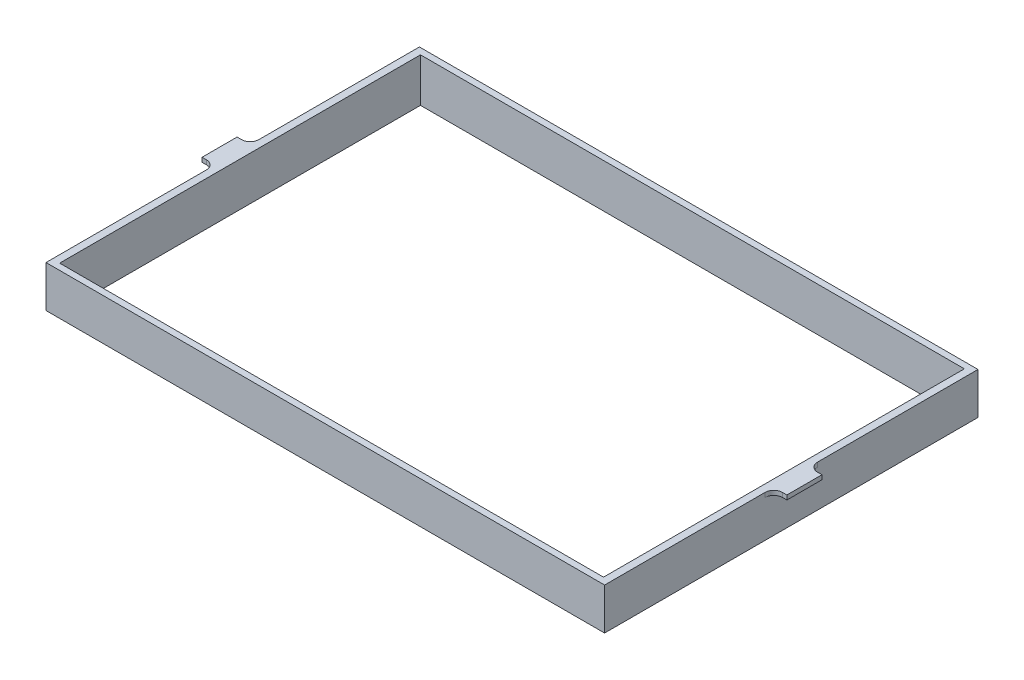
ISO-10303-21;
HEADER;
FILE_DESCRIPTION(('STEP AP214'),'2;1');
FILE_NAME('part.step','',(''),(''),'','','');
FILE_SCHEMA(('AUTOMOTIVE_DESIGN { 1 0 10303 214 1 1 1 1 }'));
ENDSEC;
DATA;
#1=APPLICATION_CONTEXT('core data for automotive mechanical design processes');
#2=APPLICATION_PROTOCOL_DEFINITION('international standard','automotive_design',2000,#1);
#3=PRODUCT_CONTEXT('',#1,'mechanical');
#4=PRODUCT('Part','Part','',(#3));
#5=PRODUCT_RELATED_PRODUCT_CATEGORY('part','',(#4));
#6=PRODUCT_DEFINITION_FORMATION('','',#4);
#7=PRODUCT_DEFINITION_CONTEXT('part definition',#1,'design');
#8=PRODUCT_DEFINITION('design','',#6,#7);
#9=PRODUCT_DEFINITION_SHAPE('','',#8);
#10=(LENGTH_UNIT() NAMED_UNIT(*) SI_UNIT(.MILLI.,.METRE.));
#11=(NAMED_UNIT(*) PLANE_ANGLE_UNIT() SI_UNIT($,.RADIAN.));
#12=(NAMED_UNIT(*) SI_UNIT($,.STERADIAN.) SOLID_ANGLE_UNIT());
#13=UNCERTAINTY_MEASURE_WITH_UNIT(LENGTH_MEASURE(1.E-05),#10,'distance_accuracy_value','');
#14=(GEOMETRIC_REPRESENTATION_CONTEXT(3) GLOBAL_UNCERTAINTY_ASSIGNED_CONTEXT((#13)) GLOBAL_UNIT_ASSIGNED_CONTEXT((#10,
#11,#12)) REPRESENTATION_CONTEXT('',''));
#15=CARTESIAN_POINT('',(0.,0.,0.));
#16=DIRECTION('',(0.,0.,1.));
#17=DIRECTION('',(1.,0.,0.));
#18=AXIS2_PLACEMENT_3D('',#15,#16,#17);
#19=CARTESIAN_POINT('',(63.78,10.,0.));
#20=DIRECTION('',(1.,0.,0.));
#21=DIRECTION('',(0.,0.,-1.));
#22=AXIS2_PLACEMENT_3D('',#19,#20,#21);
#23=PLANE('',#22);
#24=DIRECTION('',(0.,0.,1.));
#25=VECTOR('',#24,1.);
#26=CARTESIAN_POINT('',(63.78,10.,0.));
#27=LINE('',#26,#25);
#28=CARTESIAN_POINT('',(63.78,10.,-42.635));
#29=VERTEX_POINT('',#28);
#30=CARTESIAN_POINT('',(63.78,10.,-6.));
#31=VERTEX_POINT('',#30);
#32=EDGE_CURVE('E248',#29,#31,#27,.T.);
#33=ORIENTED_EDGE('',*,*,#32,.T.);
#34=DIRECTION('',(0.,-1.,0.));
#35=VECTOR('',#34,1.);
#36=CARTESIAN_POINT('',(63.78,9.,-6.));
#37=LINE('',#36,#35);
#38=CARTESIAN_POINT('',(63.78,9.,-6.));
#39=VERTEX_POINT('',#38);
#40=EDGE_CURVE('E333',#31,#39,#37,.T.);
#41=ORIENTED_EDGE('',*,*,#40,.T.);
#42=DIRECTION('',(0.,0.,1.));
#43=VECTOR('',#42,1.);
#44=CARTESIAN_POINT('',(63.78,9.,4.));
#45=LINE('',#44,#43);
#46=CARTESIAN_POINT('',(63.78,9.,6.));
#47=VERTEX_POINT('',#46);
#48=EDGE_CURVE('E206',#39,#47,#45,.T.);
#49=ORIENTED_EDGE('',*,*,#48,.T.);
#50=DIRECTION('',(0.,1.,0.));
#51=VECTOR('',#50,1.);
#52=CARTESIAN_POINT('',(63.78,10.,6.));
#53=LINE('',#52,#51);
#54=CARTESIAN_POINT('',(63.78,10.,6.));
#55=VERTEX_POINT('',#54);
#56=EDGE_CURVE('E322',#47,#55,#53,.T.);
#57=ORIENTED_EDGE('',*,*,#56,.T.);
#58=CARTESIAN_POINT('',(63.78,10.,42.635));
#59=VERTEX_POINT('',#58);
#60=EDGE_CURVE('E252',#55,#59,#27,.T.);
#61=ORIENTED_EDGE('',*,*,#60,.T.);
#62=DIRECTION('',(0.,-1.,0.));
#63=VECTOR('',#62,1.);
#64=CARTESIAN_POINT('',(63.78,10.,42.635));
#65=LINE('',#64,#63);
#66=CARTESIAN_POINT('',(63.78,0.499999999999987,42.635));
#67=VERTEX_POINT('',#66);
#68=EDGE_CURVE('E272',#59,#67,#65,.T.);
#69=ORIENTED_EDGE('',*,*,#68,.T.);
#70=DIRECTION('',(0.,0.,-1.));
#71=VECTOR('',#70,1.);
#72=CARTESIAN_POINT('',(63.78,0.499999999999987,-42.635));
#73=LINE('',#72,#71);
#74=CARTESIAN_POINT('',(63.78,0.499999999999987,-42.635));
#75=VERTEX_POINT('',#74);
#76=EDGE_CURVE('E316',#67,#75,#73,.T.);
#77=ORIENTED_EDGE('',*,*,#76,.T.);
#78=DIRECTION('',(0.,-1.,0.));
#79=VECTOR('',#78,1.);
#80=CARTESIAN_POINT('',(63.78,10.,-42.635));
#81=LINE('',#80,#79);
#82=EDGE_CURVE('E287',#29,#75,#81,.T.);
#83=ORIENTED_EDGE('',*,*,#82,.F.);
#84=EDGE_LOOP('',(#33,#41,#49,#57,#61,#69,#77,#83));
#85=FACE_BOUND('',#84,.T.);
#86=ADVANCED_FACE('F36',(#85),#23,.T.);
#87=CARTESIAN_POINT('',(-63.78,10.,0.));
#88=DIRECTION('',(1.,0.,0.));
#89=DIRECTION('',(0.,0.,-1.));
#90=AXIS2_PLACEMENT_3D('',#87,#88,#89);
#91=PLANE('',#90);
#92=DIRECTION('',(0.,0.,1.));
#93=VECTOR('',#92,1.);
#94=CARTESIAN_POINT('',(-63.78,9.,4.));
#95=LINE('',#94,#93);
#96=CARTESIAN_POINT('',(-63.78,9.,-6.));
#97=VERTEX_POINT('',#96);
#98=CARTESIAN_POINT('',(-63.78,9.,6.));
#99=VERTEX_POINT('',#98);
#100=EDGE_CURVE('E228',#97,#99,#95,.T.);
#101=ORIENTED_EDGE('',*,*,#100,.F.);
#102=DIRECTION('',(0.,-1.,0.));
#103=VECTOR('',#102,1.);
#104=CARTESIAN_POINT('',(-63.78,10.,-6.));
#105=LINE('',#104,#103);
#106=CARTESIAN_POINT('',(-63.78,10.,-6.));
#107=VERTEX_POINT('',#106);
#108=EDGE_CURVE('E345',#97,#107,#105,.F.);
#109=ORIENTED_EDGE('',*,*,#108,.T.);
#110=DIRECTION('',(0.,0.,1.));
#111=VECTOR('',#110,1.);
#112=CARTESIAN_POINT('',(-63.78,10.,0.));
#113=LINE('',#112,#111);
#114=CARTESIAN_POINT('',(-63.78,10.,-42.635));
#115=VERTEX_POINT('',#114);
#116=EDGE_CURVE('E255',#115,#107,#113,.T.);
#117=ORIENTED_EDGE('',*,*,#116,.F.);
#118=DIRECTION('',(0.,-1.,0.));
#119=VECTOR('',#118,1.);
#120=CARTESIAN_POINT('',(-63.78,10.,-42.635));
#121=LINE('',#120,#119);
#122=CARTESIAN_POINT('',(-63.78,0.499999999999987,-42.635));
#123=VERTEX_POINT('',#122);
#124=EDGE_CURVE('E300',#115,#123,#121,.T.);
#125=ORIENTED_EDGE('',*,*,#124,.T.);
#126=DIRECTION('',(0.,0.,1.));
#127=VECTOR('',#126,1.);
#128=CARTESIAN_POINT('',(-63.78,0.499999999999987,0.));
#129=LINE('',#128,#127);
#130=CARTESIAN_POINT('',(-63.78,0.499999999999987,42.635));
#131=VERTEX_POINT('',#130);
#132=EDGE_CURVE('E320',#123,#131,#129,.T.);
#133=ORIENTED_EDGE('',*,*,#132,.T.);
#134=DIRECTION('',(0.,-1.,0.));
#135=VECTOR('',#134,1.);
#136=CARTESIAN_POINT('',(-63.78,10.,42.635));
#137=LINE('',#136,#135);
#138=CARTESIAN_POINT('',(-63.78,10.,42.635));
#139=VERTEX_POINT('',#138);
#140=EDGE_CURVE('E297',#139,#131,#137,.T.);
#141=ORIENTED_EDGE('',*,*,#140,.F.);
#142=CARTESIAN_POINT('',(-63.78,10.,6.));
#143=VERTEX_POINT('',#142);
#144=EDGE_CURVE('E254',#143,#139,#113,.T.);
#145=ORIENTED_EDGE('',*,*,#144,.F.);
#146=DIRECTION('',(0.,1.,0.));
#147=VECTOR('',#146,1.);
#148=CARTESIAN_POINT('',(-63.78,9.,6.));
#149=LINE('',#148,#147);
#150=EDGE_CURVE('E342',#143,#99,#149,.F.);
#151=ORIENTED_EDGE('',*,*,#150,.T.);
#152=EDGE_LOOP('',(#101,#109,#117,#125,#133,#141,#145,#151));
#153=FACE_BOUND('',#152,.T.);
#154=ADVANCED_FACE('F368',(#153),#91,.F.);
#155=CARTESIAN_POINT('',(0.,10.,41.2));
#156=DIRECTION('',(0.,0.,1.));
#157=DIRECTION('',(1.,0.,0.));
#158=AXIS2_PLACEMENT_3D('',#155,#156,#157);
#159=PLANE('',#158);
#160=DIRECTION('',(-1.,0.,0.));
#161=VECTOR('',#160,1.);
#162=CARTESIAN_POINT('',(0.,0.,41.2));
#163=LINE('',#162,#161);
#164=CARTESIAN_POINT('',(62.1,0.,41.2));
#165=VERTEX_POINT('',#164);
#166=CARTESIAN_POINT('',(-62.1,0.,41.2));
#167=VERTEX_POINT('',#166);
#168=EDGE_CURVE('E247',#165,#167,#163,.T.);
#169=ORIENTED_EDGE('',*,*,#168,.T.);
#170=DIRECTION('',(0.,-1.,0.));
#171=VECTOR('',#170,1.);
#172=CARTESIAN_POINT('',(-62.1,10.,41.2));
#173=LINE('',#172,#171);
#174=CARTESIAN_POINT('',(-62.1,10.,41.2));
#175=VERTEX_POINT('',#174);
#176=EDGE_CURVE('E291',#175,#167,#173,.T.);
#177=ORIENTED_EDGE('',*,*,#176,.F.);
#178=DIRECTION('',(-1.,0.,0.));
#179=VECTOR('',#178,1.);
#180=CARTESIAN_POINT('',(0.,10.,41.2));
#181=LINE('',#180,#179);
#182=CARTESIAN_POINT('',(62.1,10.,41.2));
#183=VERTEX_POINT('',#182);
#184=EDGE_CURVE('E261',#183,#175,#181,.T.);
#185=ORIENTED_EDGE('',*,*,#184,.F.);
#186=DIRECTION('',(0.,-1.,0.));
#187=VECTOR('',#186,1.);
#188=CARTESIAN_POINT('',(62.1,10.,41.2));
#189=LINE('',#188,#187);
#190=EDGE_CURVE('E284',#183,#165,#189,.T.);
#191=ORIENTED_EDGE('',*,*,#190,.T.);
#192=EDGE_LOOP('',(#169,#177,#185,#191));
#193=FACE_BOUND('',#192,.T.);
#194=ADVANCED_FACE('F439',(#193),#159,.F.);
#195=CARTESIAN_POINT('',(-62.1,10.,0.));
#196=DIRECTION('',(-1.,0.,0.));
#197=DIRECTION('',(0.,0.,1.));
#198=AXIS2_PLACEMENT_3D('',#195,#196,#197);
#199=PLANE('',#198);
#200=DIRECTION('',(0.,0.,-1.));
#201=VECTOR('',#200,1.);
#202=CARTESIAN_POINT('',(-62.1,0.,0.));
#203=LINE('',#202,#201);
#204=CARTESIAN_POINT('',(-62.1,0.,-41.2));
#205=VERTEX_POINT('',#204);
#206=EDGE_CURVE('E275',#167,#205,#203,.T.);
#207=ORIENTED_EDGE('',*,*,#206,.T.);
#208=DIRECTION('',(0.,-1.,0.));
#209=VECTOR('',#208,1.);
#210=CARTESIAN_POINT('',(-62.1,10.,-41.2));
#211=LINE('',#210,#209);
#212=CARTESIAN_POINT('',(-62.1,10.,-41.2));
#213=VERTEX_POINT('',#212);
#214=EDGE_CURVE('E289',#213,#205,#211,.T.);
#215=ORIENTED_EDGE('',*,*,#214,.F.);
#216=DIRECTION('',(0.,0.,-1.));
#217=VECTOR('',#216,1.);
#218=CARTESIAN_POINT('',(-62.1,10.,0.));
#219=LINE('',#218,#217);
#220=EDGE_CURVE('E264',#175,#213,#219,.T.);
#221=ORIENTED_EDGE('',*,*,#220,.F.);
#222=ORIENTED_EDGE('',*,*,#176,.T.);
#223=EDGE_LOOP('',(#207,#215,#221,#222));
#224=FACE_BOUND('',#223,.T.);
#225=ADVANCED_FACE('F479',(#224),#199,.F.);
#226=CARTESIAN_POINT('',(0.,10.,-41.2));
#227=DIRECTION('',(0.,0.,1.));
#228=DIRECTION('',(1.,0.,0.));
#229=AXIS2_PLACEMENT_3D('',#226,#227,#228);
#230=PLANE('',#229);
#231=DIRECTION('',(-1.,0.,0.));
#232=VECTOR('',#231,1.);
#233=CARTESIAN_POINT('',(0.,0.,-41.2));
#234=LINE('',#233,#232);
#235=CARTESIAN_POINT('',(62.1,0.,-41.2));
#236=VERTEX_POINT('',#235);
#237=EDGE_CURVE('E278',#236,#205,#234,.T.);
#238=ORIENTED_EDGE('',*,*,#237,.F.);
#239=DIRECTION('',(0.,-1.,0.));
#240=VECTOR('',#239,1.);
#241=CARTESIAN_POINT('',(62.1,10.,-41.2));
#242=LINE('',#241,#240);
#243=CARTESIAN_POINT('',(62.1,10.,-41.2));
#244=VERTEX_POINT('',#243);
#245=EDGE_CURVE('E286',#244,#236,#242,.T.);
#246=ORIENTED_EDGE('',*,*,#245,.F.);
#247=DIRECTION('',(-1.,0.,0.));
#248=VECTOR('',#247,1.);
#249=CARTESIAN_POINT('',(0.,10.,-41.2));
#250=LINE('',#249,#248);
#251=EDGE_CURVE('E266',#244,#213,#250,.T.);
#252=ORIENTED_EDGE('',*,*,#251,.T.);
#253=ORIENTED_EDGE('',*,*,#214,.T.);
#254=EDGE_LOOP('',(#238,#246,#252,#253));
#255=FACE_BOUND('',#254,.T.);
#256=ADVANCED_FACE('F476',(#255),#230,.T.);
#257=CARTESIAN_POINT('',(0.,10.,-42.635));
#258=DIRECTION('',(0.,0.,1.));
#259=DIRECTION('',(1.,0.,0.));
#260=AXIS2_PLACEMENT_3D('',#257,#258,#259);
#261=PLANE('',#260);
#262=ORIENTED_EDGE('',*,*,#82,.T.);
#263=DIRECTION('',(-1.,0.,0.));
#264=VECTOR('',#263,1.);
#265=CARTESIAN_POINT('',(0.,0.499999999999987,-42.635));
#266=LINE('',#265,#264);
#267=EDGE_CURVE('E318',#75,#123,#266,.T.);
#268=ORIENTED_EDGE('',*,*,#267,.T.);
#269=ORIENTED_EDGE('',*,*,#124,.F.);
#270=DIRECTION('',(-1.,0.,0.));
#271=VECTOR('',#270,1.);
#272=CARTESIAN_POINT('',(0.,10.,-42.635));
#273=LINE('',#272,#271);
#274=EDGE_CURVE('E251',#29,#115,#273,.T.);
#275=ORIENTED_EDGE('',*,*,#274,.F.);
#276=EDGE_LOOP('',(#262,#268,#269,#275));
#277=FACE_BOUND('',#276,.T.);
#278=ADVANCED_FACE('F389',(#277),#261,.F.);
#279=CARTESIAN_POINT('',(0.,10.,42.635));
#280=DIRECTION('',(0.,0.,1.));
#281=DIRECTION('',(1.,0.,0.));
#282=AXIS2_PLACEMENT_3D('',#279,#280,#281);
#283=PLANE('',#282);
#284=ORIENTED_EDGE('',*,*,#140,.T.);
#285=DIRECTION('',(1.,0.,0.));
#286=VECTOR('',#285,1.);
#287=CARTESIAN_POINT('',(63.78,0.499999999999987,42.635));
#288=LINE('',#287,#286);
#289=EDGE_CURVE('E313',#131,#67,#288,.T.);
#290=ORIENTED_EDGE('',*,*,#289,.T.);
#291=ORIENTED_EDGE('',*,*,#68,.F.);
#292=DIRECTION('',(-1.,0.,0.));
#293=VECTOR('',#292,1.);
#294=CARTESIAN_POINT('',(0.,10.,42.635));
#295=LINE('',#294,#293);
#296=EDGE_CURVE('E258',#59,#139,#295,.T.);
#297=ORIENTED_EDGE('',*,*,#296,.T.);
#298=EDGE_LOOP('',(#284,#290,#291,#297));
#299=FACE_BOUND('',#298,.T.);
#300=ADVANCED_FACE('F409',(#299),#283,.T.);
#301=CARTESIAN_POINT('',(62.1,10.,0.));
#302=DIRECTION('',(-1.,0.,0.));
#303=DIRECTION('',(0.,0.,1.));
#304=AXIS2_PLACEMENT_3D('',#301,#302,#303);
#305=PLANE('',#304);
#306=DIRECTION('',(0.,0.,-1.));
#307=VECTOR('',#306,1.);
#308=CARTESIAN_POINT('',(62.1,0.,0.));
#309=LINE('',#308,#307);
#310=EDGE_CURVE('E281',#165,#236,#309,.T.);
#311=ORIENTED_EDGE('',*,*,#310,.F.);
#312=ORIENTED_EDGE('',*,*,#190,.F.);
#313=DIRECTION('',(0.,0.,-1.));
#314=VECTOR('',#313,1.);
#315=CARTESIAN_POINT('',(62.1,10.,0.));
#316=LINE('',#315,#314);
#317=EDGE_CURVE('E269',#183,#244,#316,.T.);
#318=ORIENTED_EDGE('',*,*,#317,.T.);
#319=ORIENTED_EDGE('',*,*,#245,.T.);
#320=EDGE_LOOP('',(#311,#312,#318,#319));
#321=FACE_BOUND('',#320,.T.);
#322=ADVANCED_FACE('F469',(#321),#305,.T.);
#323=CARTESIAN_POINT('',(0.,10.,0.));
#324=DIRECTION('',(0.,1.,0.));
#325=DIRECTION('',(0.,0.,1.));
#326=AXIS2_PLACEMENT_3D('',#323,#324,#325);
#327=PLANE('',#326);
#328=ORIENTED_EDGE('',*,*,#32,.F.);
#329=ORIENTED_EDGE('',*,*,#274,.T.);
#330=ORIENTED_EDGE('',*,*,#116,.T.);
#331=CARTESIAN_POINT('',(-65.78,10.,-6.));
#332=DIRECTION('',(0.,1.,0.));
#333=DIRECTION('',(0.,0.,1.));
#334=AXIS2_PLACEMENT_3D('',#331,#332,#333);
#335=CIRCLE('',#334,2.);
#336=CARTESIAN_POINT('',(-65.78,10.,-4.));
#337=VERTEX_POINT('',#336);
#338=EDGE_CURVE('E361',#107,#337,#335,.F.);
#339=ORIENTED_EDGE('',*,*,#338,.T.);
#340=DIRECTION('',(1.,0.,0.));
#341=VECTOR('',#340,1.);
#342=CARTESIAN_POINT('',(-66.78,10.,-4.));
#343=LINE('',#342,#341);
#344=CARTESIAN_POINT('',(-66.78,10.,-4.));
#345=VERTEX_POINT('',#344);
#346=EDGE_CURVE('E234',#345,#337,#343,.T.);
#347=ORIENTED_EDGE('',*,*,#346,.F.);
#348=DIRECTION('',(0.,0.,-1.));
#349=VECTOR('',#348,1.);
#350=CARTESIAN_POINT('',(-66.78,10.,4.));
#351=LINE('',#350,#349);
#352=CARTESIAN_POINT('',(-66.78,10.,4.));
#353=VERTEX_POINT('',#352);
#354=EDGE_CURVE('E232',#353,#345,#351,.T.);
#355=ORIENTED_EDGE('',*,*,#354,.F.);
#356=DIRECTION('',(1.,0.,0.));
#357=VECTOR('',#356,1.);
#358=CARTESIAN_POINT('',(-66.78,10.,4.));
#359=LINE('',#358,#357);
#360=CARTESIAN_POINT('',(-65.78,10.,4.));
#361=VERTEX_POINT('',#360);
#362=EDGE_CURVE('E239',#353,#361,#359,.T.);
#363=ORIENTED_EDGE('',*,*,#362,.T.);
#364=CARTESIAN_POINT('',(-65.78,10.,6.));
#365=DIRECTION('',(0.,1.,0.));
#366=DIRECTION('',(0.,0.,1.));
#367=AXIS2_PLACEMENT_3D('',#364,#365,#366);
#368=CIRCLE('',#367,2.);
#369=EDGE_CURVE('E44',#361,#143,#368,.F.);
#370=ORIENTED_EDGE('',*,*,#369,.T.);
#371=ORIENTED_EDGE('',*,*,#144,.T.);
#372=ORIENTED_EDGE('',*,*,#296,.F.);
#373=ORIENTED_EDGE('',*,*,#60,.F.);
#374=CARTESIAN_POINT('',(65.78,10.,6.));
#375=DIRECTION('',(0.,1.,0.));
#376=DIRECTION('',(0.,0.,1.));
#377=AXIS2_PLACEMENT_3D('',#374,#375,#376);
#378=CIRCLE('',#377,2.);
#379=CARTESIAN_POINT('',(65.78,10.,4.));
#380=VERTEX_POINT('',#379);
#381=EDGE_CURVE('E353',#55,#380,#378,.F.);
#382=ORIENTED_EDGE('',*,*,#381,.T.);
#383=DIRECTION('',(-1.,0.,0.));
#384=VECTOR('',#383,1.);
#385=CARTESIAN_POINT('',(66.78,10.,4.));
#386=LINE('',#385,#384);
#387=CARTESIAN_POINT('',(66.78,10.,4.));
#388=VERTEX_POINT('',#387);
#389=EDGE_CURVE('E196',#388,#380,#386,.T.);
#390=ORIENTED_EDGE('',*,*,#389,.F.);
#391=DIRECTION('',(0.,0.,-1.));
#392=VECTOR('',#391,1.);
#393=CARTESIAN_POINT('',(66.78,10.,4.));
#394=LINE('',#393,#392);
#395=CARTESIAN_POINT('',(66.78,10.,-4.));
#396=VERTEX_POINT('',#395);
#397=EDGE_CURVE('E202',#388,#396,#394,.T.);
#398=ORIENTED_EDGE('',*,*,#397,.T.);
#399=DIRECTION('',(-1.,0.,0.));
#400=VECTOR('',#399,1.);
#401=CARTESIAN_POINT('',(66.78,10.,-4.));
#402=LINE('',#401,#400);
#403=CARTESIAN_POINT('',(65.78,10.,-4.));
#404=VERTEX_POINT('',#403);
#405=EDGE_CURVE('E184',#396,#404,#402,.T.);
#406=ORIENTED_EDGE('',*,*,#405,.T.);
#407=CARTESIAN_POINT('',(65.78,10.,-6.));
#408=DIRECTION('',(0.,1.,0.));
#409=DIRECTION('',(0.,0.,1.));
#410=AXIS2_PLACEMENT_3D('',#407,#408,#409);
#411=CIRCLE('',#410,2.);
#412=EDGE_CURVE('E351',#404,#31,#411,.F.);
#413=ORIENTED_EDGE('',*,*,#412,.T.);
#414=EDGE_LOOP('',(#328,#329,#330,#339,#347,#355,#363,#370,#371,#372,#373,#382,#390,#398,#406,#413));
#415=FACE_BOUND('',#414,.T.);
#416=ORIENTED_EDGE('',*,*,#184,.T.);
#417=ORIENTED_EDGE('',*,*,#220,.T.);
#418=ORIENTED_EDGE('',*,*,#251,.F.);
#419=ORIENTED_EDGE('',*,*,#317,.F.);
#420=EDGE_LOOP('',(#416,#417,#418,#419));
#421=FACE_BOUND('',#420,.T.);
#422=ADVANCED_FACE('F209',(#415,#421),#327,.T.);
#423=CARTESIAN_POINT('',(0.,0.,0.));
#424=DIRECTION('',(0.,1.,0.));
#425=DIRECTION('',(0.,0.,1.));
#426=AXIS2_PLACEMENT_3D('',#423,#424,#425);
#427=PLANE('',#426);
#428=DIRECTION('',(0.,0.,1.));
#429=VECTOR('',#428,1.);
#430=CARTESIAN_POINT('',(63.28,0.,42.635));
#431=LINE('',#430,#429);
#432=CARTESIAN_POINT('',(63.28,0.,-42.135));
#433=VERTEX_POINT('',#432);
#434=CARTESIAN_POINT('',(63.28,0.,42.135));
#435=VERTEX_POINT('',#434);
#436=EDGE_CURVE('E308',#433,#435,#431,.T.);
#437=ORIENTED_EDGE('',*,*,#436,.T.);
#438=DIRECTION('',(-1.,0.,0.));
#439=VECTOR('',#438,1.);
#440=CARTESIAN_POINT('',(-63.78,0.,42.135));
#441=LINE('',#440,#439);
#442=CARTESIAN_POINT('',(-63.28,0.,42.135));
#443=VERTEX_POINT('',#442);
#444=EDGE_CURVE('E310',#435,#443,#441,.T.);
#445=ORIENTED_EDGE('',*,*,#444,.T.);
#446=DIRECTION('',(0.,0.,-1.));
#447=VECTOR('',#446,1.);
#448=CARTESIAN_POINT('',(-63.28,0.,0.));
#449=LINE('',#448,#447);
#450=CARTESIAN_POINT('',(-63.28,0.,-42.135));
#451=VERTEX_POINT('',#450);
#452=EDGE_CURVE('E294',#443,#451,#449,.T.);
#453=ORIENTED_EDGE('',*,*,#452,.T.);
#454=DIRECTION('',(1.,0.,0.));
#455=VECTOR('',#454,1.);
#456=CARTESIAN_POINT('',(0.,0.,-42.135));
#457=LINE('',#456,#455);
#458=EDGE_CURVE('E306',#451,#433,#457,.T.);
#459=ORIENTED_EDGE('',*,*,#458,.T.);
#460=EDGE_LOOP('',(#437,#445,#453,#459));
#461=FACE_BOUND('',#460,.T.);
#462=ORIENTED_EDGE('',*,*,#168,.F.);
#463=ORIENTED_EDGE('',*,*,#310,.T.);
#464=ORIENTED_EDGE('',*,*,#237,.T.);
#465=ORIENTED_EDGE('',*,*,#206,.F.);
#466=EDGE_LOOP('',(#462,#463,#464,#465));
#467=FACE_BOUND('',#466,.T.);
#468=ADVANCED_FACE('F466',(#461,#467),#427,.F.);
#469=CARTESIAN_POINT('',(-66.78,10.,-4.));
#470=DIRECTION('',(0.,0.,1.));
#471=DIRECTION('',(1.,0.,0.));
#472=AXIS2_PLACEMENT_3D('',#469,#470,#471);
#473=PLANE('',#472);
#474=ORIENTED_EDGE('',*,*,#346,.T.);
#475=DIRECTION('',(0.,-1.,0.));
#476=VECTOR('',#475,1.);
#477=CARTESIAN_POINT('',(-65.78,9.,-4.));
#478=LINE('',#477,#476);
#479=CARTESIAN_POINT('',(-65.78,9.,-4.));
#480=VERTEX_POINT('',#479);
#481=EDGE_CURVE('E339',#337,#480,#478,.T.);
#482=ORIENTED_EDGE('',*,*,#481,.T.);
#483=DIRECTION('',(1.,0.,0.));
#484=VECTOR('',#483,1.);
#485=CARTESIAN_POINT('',(-66.78,9.,-4.));
#486=LINE('',#485,#484);
#487=CARTESIAN_POINT('',(-66.78,9.,-4.));
#488=VERTEX_POINT('',#487);
#489=EDGE_CURVE('E244',#488,#480,#486,.T.);
#490=ORIENTED_EDGE('',*,*,#489,.F.);
#491=DIRECTION('',(0.,-1.,0.));
#492=VECTOR('',#491,1.);
#493=CARTESIAN_POINT('',(-66.78,10.,-4.));
#494=LINE('',#493,#492);
#495=EDGE_CURVE('E224',#345,#488,#494,.T.);
#496=ORIENTED_EDGE('',*,*,#495,.F.);
#497=EDGE_LOOP('',(#474,#482,#490,#496));
#498=FACE_BOUND('',#497,.T.);
#499=ADVANCED_FACE('F379',(#498),#473,.F.);
#500=CARTESIAN_POINT('',(-66.78,9.,4.));
#501=DIRECTION('',(0.,1.,0.));
#502=DIRECTION('',(0.,0.,1.));
#503=AXIS2_PLACEMENT_3D('',#500,#501,#502);
#504=PLANE('',#503);
#505=ORIENTED_EDGE('',*,*,#100,.T.);
#506=CARTESIAN_POINT('',(-65.78,9.,6.));
#507=DIRECTION('',(0.,1.,0.));
#508=DIRECTION('',(0.,0.,1.));
#509=AXIS2_PLACEMENT_3D('',#506,#507,#508);
#510=CIRCLE('',#509,2.);
#511=CARTESIAN_POINT('',(-65.78,9.,4.));
#512=VERTEX_POINT('',#511);
#513=EDGE_CURVE('E11',#99,#512,#510,.T.);
#514=ORIENTED_EDGE('',*,*,#513,.T.);
#515=DIRECTION('',(1.,0.,0.));
#516=VECTOR('',#515,1.);
#517=CARTESIAN_POINT('',(-66.78,9.,4.));
#518=LINE('',#517,#516);
#519=CARTESIAN_POINT('',(-66.78,9.,4.));
#520=VERTEX_POINT('',#519);
#521=EDGE_CURVE('E242',#520,#512,#518,.T.);
#522=ORIENTED_EDGE('',*,*,#521,.F.);
#523=DIRECTION('',(0.,0.,1.));
#524=VECTOR('',#523,1.);
#525=CARTESIAN_POINT('',(-66.78,9.,4.));
#526=LINE('',#525,#524);
#527=EDGE_CURVE('E227',#488,#520,#526,.T.);
#528=ORIENTED_EDGE('',*,*,#527,.F.);
#529=ORIENTED_EDGE('',*,*,#489,.T.);
#530=CARTESIAN_POINT('',(-65.78,9.,-6.));
#531=DIRECTION('',(0.,1.,0.));
#532=DIRECTION('',(0.,0.,1.));
#533=AXIS2_PLACEMENT_3D('',#530,#531,#532);
#534=CIRCLE('',#533,2.);
#535=EDGE_CURVE('E358',#480,#97,#534,.T.);
#536=ORIENTED_EDGE('',*,*,#535,.T.);
#537=EDGE_LOOP('',(#505,#514,#522,#528,#529,#536));
#538=FACE_BOUND('',#537,.T.);
#539=ADVANCED_FACE('F372',(#538),#504,.F.);
#540=CARTESIAN_POINT('',(-66.78,10.,4.));
#541=DIRECTION('',(0.,0.,-1.));
#542=DIRECTION('',(-1.,0.,0.));
#543=AXIS2_PLACEMENT_3D('',#540,#541,#542);
#544=PLANE('',#543);
#545=ORIENTED_EDGE('',*,*,#521,.T.);
#546=DIRECTION('',(0.,1.,0.));
#547=VECTOR('',#546,1.);
#548=CARTESIAN_POINT('',(-65.78,10.,4.));
#549=LINE('',#548,#547);
#550=EDGE_CURVE('E347',#512,#361,#549,.T.);
#551=ORIENTED_EDGE('',*,*,#550,.T.);
#552=ORIENTED_EDGE('',*,*,#362,.F.);
#553=DIRECTION('',(0.,1.,0.));
#554=VECTOR('',#553,1.);
#555=CARTESIAN_POINT('',(-66.78,10.,4.));
#556=LINE('',#555,#554);
#557=EDGE_CURVE('E230',#520,#353,#556,.T.);
#558=ORIENTED_EDGE('',*,*,#557,.F.);
#559=EDGE_LOOP('',(#545,#551,#552,#558));
#560=FACE_BOUND('',#559,.T.);
#561=ADVANCED_FACE('F370',(#560),#544,.F.);
#562=CARTESIAN_POINT('',(-66.78,0.,0.));
#563=DIRECTION('',(1.,0.,0.));
#564=DIRECTION('',(0.,0.,-1.));
#565=AXIS2_PLACEMENT_3D('',#562,#563,#564);
#566=PLANE('',#565);
#567=ORIENTED_EDGE('',*,*,#495,.T.);
#568=ORIENTED_EDGE('',*,*,#527,.T.);
#569=ORIENTED_EDGE('',*,*,#557,.T.);
#570=ORIENTED_EDGE('',*,*,#354,.T.);
#571=EDGE_LOOP('',(#567,#568,#569,#570));
#572=FACE_BOUND('',#571,.T.);
#573=ADVANCED_FACE('F376',(#572),#566,.F.);
#574=CARTESIAN_POINT('',(0.,0.499999999999987,-42.635));
#575=DIRECTION('',(0.,0.707106781186557,0.707106781186538));
#576=DIRECTION('',(-1.,0.,0.));
#577=AXIS2_PLACEMENT_3D('',#574,#575,#576);
#578=PLANE('',#577);
#579=DIRECTION('',(0.577350269189631,-0.577350269189615,0.577350269189631));
#580=VECTOR('',#579,1.);
#581=CARTESIAN_POINT('',(-49.5683333333331,-13.7116666666665,-28.4233333333331));
#582=LINE('',#581,#580);
#583=EDGE_CURVE('E326',#123,#451,#582,.T.);
#584=ORIENTED_EDGE('',*,*,#583,.F.);
#585=ORIENTED_EDGE('',*,*,#267,.F.);
#586=DIRECTION('',(0.577350269189631,0.577350269189615,-0.577350269189631));
#587=VECTOR('',#586,1.);
#588=CARTESIAN_POINT('',(42.5199999999996,-20.7599999999998,-21.3749999999996));
#589=LINE('',#588,#587);
#590=EDGE_CURVE('E236',#433,#75,#589,.T.);
#591=ORIENTED_EDGE('',*,*,#590,.F.);
#592=ORIENTED_EDGE('',*,*,#458,.F.);
#593=EDGE_LOOP('',(#584,#585,#591,#592));
#594=FACE_BOUND('',#593,.T.);
#595=ADVANCED_FACE('F395',(#594),#578,.F.);
#596=CARTESIAN_POINT('',(63.28,0.,0.));
#597=DIRECTION('',(0.707106781186538,-0.707106781186557,0.));
#598=DIRECTION('',(0.,0.,-1.));
#599=AXIS2_PLACEMENT_3D('',#596,#597,#598);
#600=PLANE('',#599);
#601=ORIENTED_EDGE('',*,*,#590,.T.);
#602=ORIENTED_EDGE('',*,*,#76,.F.);
#603=DIRECTION('',(-0.577350269189631,-0.577350269189615,-0.577350269189631));
#604=VECTOR('',#603,1.);
#605=CARTESIAN_POINT('',(49.2349999999998,-14.0449999999999,28.0899999999997));
#606=LINE('',#605,#604);
#607=EDGE_CURVE('E324',#435,#67,#606,.F.);
#608=ORIENTED_EDGE('',*,*,#607,.F.);
#609=ORIENTED_EDGE('',*,*,#436,.F.);
#610=EDGE_LOOP('',(#601,#602,#608,#609));
#611=FACE_BOUND('',#610,.T.);
#612=ADVANCED_FACE('F447',(#611),#600,.T.);
#613=CARTESIAN_POINT('',(-63.78,0.499999999999987,0.));
#614=DIRECTION('',(0.707106781186538,0.707106781186557,0.));
#615=DIRECTION('',(0.,0.,1.));
#616=AXIS2_PLACEMENT_3D('',#613,#614,#615);
#617=PLANE('',#616);
#618=ORIENTED_EDGE('',*,*,#583,.T.);
#619=ORIENTED_EDGE('',*,*,#452,.F.);
#620=DIRECTION('',(0.577350269189631,-0.577350269189615,-0.577350269189631));
#621=VECTOR('',#620,1.);
#622=CARTESIAN_POINT('',(-49.5683333333331,-13.7116666666666,28.4233333333331));
#623=LINE('',#622,#621);
#624=EDGE_CURVE('E195',#131,#443,#623,.T.);
#625=ORIENTED_EDGE('',*,*,#624,.F.);
#626=ORIENTED_EDGE('',*,*,#132,.F.);
#627=EDGE_LOOP('',(#618,#619,#625,#626));
#628=FACE_BOUND('',#627,.T.);
#629=ADVANCED_FACE('F400',(#628),#617,.F.);
#630=CARTESIAN_POINT('',(0.,0.,42.135));
#631=DIRECTION('',(0.,-0.707106781186557,0.707106781186538));
#632=DIRECTION('',(1.,0.,0.));
#633=AXIS2_PLACEMENT_3D('',#630,#631,#632);
#634=PLANE('',#633);
#635=ORIENTED_EDGE('',*,*,#607,.T.);
#636=ORIENTED_EDGE('',*,*,#289,.F.);
#637=ORIENTED_EDGE('',*,*,#624,.T.);
#638=ORIENTED_EDGE('',*,*,#444,.F.);
#639=EDGE_LOOP('',(#635,#636,#637,#638));
#640=FACE_BOUND('',#639,.T.);
#641=ADVANCED_FACE('F404',(#640),#634,.T.);
#642=CARTESIAN_POINT('',(66.78,10.,-4.));
#643=DIRECTION('',(0.,0.,-1.));
#644=DIRECTION('',(-1.,0.,0.));
#645=AXIS2_PLACEMENT_3D('',#642,#643,#644);
#646=PLANE('',#645);
#647=DIRECTION('',(-1.,0.,0.));
#648=VECTOR('',#647,1.);
#649=CARTESIAN_POINT('',(66.78,9.,-4.));
#650=LINE('',#649,#648);
#651=CARTESIAN_POINT('',(66.78,9.,-4.));
#652=VERTEX_POINT('',#651);
#653=CARTESIAN_POINT('',(65.78,9.,-4.));
#654=VERTEX_POINT('',#653);
#655=EDGE_CURVE('E217',#652,#654,#650,.T.);
#656=ORIENTED_EDGE('',*,*,#655,.T.);
#657=DIRECTION('',(0.,-1.,0.));
#658=VECTOR('',#657,1.);
#659=CARTESIAN_POINT('',(65.78,10.,-4.));
#660=LINE('',#659,#658);
#661=EDGE_CURVE('E191',#654,#404,#660,.F.);
#662=ORIENTED_EDGE('',*,*,#661,.T.);
#663=ORIENTED_EDGE('',*,*,#405,.F.);
#664=DIRECTION('',(0.,-1.,0.));
#665=VECTOR('',#664,1.);
#666=CARTESIAN_POINT('',(66.78,10.,-4.));
#667=LINE('',#666,#665);
#668=EDGE_CURVE('E188',#396,#652,#667,.T.);
#669=ORIENTED_EDGE('',*,*,#668,.T.);
#670=EDGE_LOOP('',(#656,#662,#663,#669));
#671=FACE_BOUND('',#670,.T.);
#672=ADVANCED_FACE('F187',(#671),#646,.T.);
#673=CARTESIAN_POINT('',(66.78,10.,4.));
#674=DIRECTION('',(0.,0.,1.));
#675=DIRECTION('',(1.,0.,0.));
#676=AXIS2_PLACEMENT_3D('',#673,#674,#675);
#677=PLANE('',#676);
#678=ORIENTED_EDGE('',*,*,#389,.T.);
#679=DIRECTION('',(0.,1.,0.));
#680=VECTOR('',#679,1.);
#681=CARTESIAN_POINT('',(65.78,9.,4.));
#682=LINE('',#681,#680);
#683=CARTESIAN_POINT('',(65.78,9.,4.));
#684=VERTEX_POINT('',#683);
#685=EDGE_CURVE('E337',#380,#684,#682,.F.);
#686=ORIENTED_EDGE('',*,*,#685,.T.);
#687=DIRECTION('',(-1.,0.,0.));
#688=VECTOR('',#687,1.);
#689=CARTESIAN_POINT('',(66.78,9.,4.));
#690=LINE('',#689,#688);
#691=CARTESIAN_POINT('',(66.78,9.,4.));
#692=VERTEX_POINT('',#691);
#693=EDGE_CURVE('E220',#692,#684,#690,.T.);
#694=ORIENTED_EDGE('',*,*,#693,.F.);
#695=DIRECTION('',(0.,1.,0.));
#696=VECTOR('',#695,1.);
#697=CARTESIAN_POINT('',(66.78,10.,4.));
#698=LINE('',#697,#696);
#699=EDGE_CURVE('E212',#692,#388,#698,.T.);
#700=ORIENTED_EDGE('',*,*,#699,.T.);
#701=EDGE_LOOP('',(#678,#686,#694,#700));
#702=FACE_BOUND('',#701,.T.);
#703=ADVANCED_FACE('F416',(#702),#677,.T.);
#704=CARTESIAN_POINT('',(66.78,9.,4.));
#705=DIRECTION('',(0.,-1.,0.));
#706=DIRECTION('',(0.,0.,-1.));
#707=AXIS2_PLACEMENT_3D('',#704,#705,#706);
#708=PLANE('',#707);
#709=ORIENTED_EDGE('',*,*,#48,.F.);
#710=CARTESIAN_POINT('',(65.78,9.,-6.));
#711=DIRECTION('',(0.,-1.,0.));
#712=DIRECTION('',(0.,0.,-1.));
#713=AXIS2_PLACEMENT_3D('',#710,#711,#712);
#714=CIRCLE('',#713,2.);
#715=EDGE_CURVE('E349',#39,#654,#714,.F.);
#716=ORIENTED_EDGE('',*,*,#715,.T.);
#717=ORIENTED_EDGE('',*,*,#655,.F.);
#718=DIRECTION('',(0.,0.,1.));
#719=VECTOR('',#718,1.);
#720=CARTESIAN_POINT('',(66.78,9.,4.));
#721=LINE('',#720,#719);
#722=EDGE_CURVE('E205',#652,#692,#721,.T.);
#723=ORIENTED_EDGE('',*,*,#722,.T.);
#724=ORIENTED_EDGE('',*,*,#693,.T.);
#725=CARTESIAN_POINT('',(65.78,9.,6.));
#726=DIRECTION('',(0.,-1.,0.));
#727=DIRECTION('',(0.,0.,-1.));
#728=AXIS2_PLACEMENT_3D('',#725,#726,#727);
#729=CIRCLE('',#728,2.);
#730=EDGE_CURVE('E355',#684,#47,#729,.F.);
#731=ORIENTED_EDGE('',*,*,#730,.T.);
#732=EDGE_LOOP('',(#709,#716,#717,#723,#724,#731));
#733=FACE_BOUND('',#732,.T.);
#734=ADVANCED_FACE('F420',(#733),#708,.T.);
#735=CARTESIAN_POINT('',(66.78,0.,0.));
#736=DIRECTION('',(-1.,0.,0.));
#737=DIRECTION('',(0.,0.,-1.));
#738=AXIS2_PLACEMENT_3D('',#735,#736,#737);
#739=PLANE('',#738);
#740=ORIENTED_EDGE('',*,*,#668,.F.);
#741=ORIENTED_EDGE('',*,*,#397,.F.);
#742=ORIENTED_EDGE('',*,*,#699,.F.);
#743=ORIENTED_EDGE('',*,*,#722,.F.);
#744=EDGE_LOOP('',(#740,#741,#742,#743));
#745=FACE_BOUND('',#744,.T.);
#746=ADVANCED_FACE('F200',(#745),#739,.F.);
#747=CARTESIAN_POINT('',(65.78,10.,-6.));
#748=DIRECTION('',(0.,1.,0.));
#749=DIRECTION('',(0.,0.,1.));
#750=AXIS2_PLACEMENT_3D('',#747,#748,#749);
#751=CYLINDRICAL_SURFACE('',#750,2.);
#752=ORIENTED_EDGE('',*,*,#412,.F.);
#753=ORIENTED_EDGE('',*,*,#661,.F.);
#754=ORIENTED_EDGE('',*,*,#715,.F.);
#755=ORIENTED_EDGE('',*,*,#40,.F.);
#756=EDGE_LOOP('',(#752,#753,#754,#755));
#757=FACE_BOUND('',#756,.T.);
#758=ADVANCED_FACE('F423',(#757),#751,.F.);
#759=CARTESIAN_POINT('',(65.78,10.,6.));
#760=DIRECTION('',(0.,-1.,0.));
#761=DIRECTION('',(0.,0.,-1.));
#762=AXIS2_PLACEMENT_3D('',#759,#760,#761);
#763=CYLINDRICAL_SURFACE('',#762,2.);
#764=ORIENTED_EDGE('',*,*,#730,.F.);
#765=ORIENTED_EDGE('',*,*,#685,.F.);
#766=ORIENTED_EDGE('',*,*,#381,.F.);
#767=ORIENTED_EDGE('',*,*,#56,.F.);
#768=EDGE_LOOP('',(#764,#765,#766,#767));
#769=FACE_BOUND('',#768,.T.);
#770=ADVANCED_FACE('F418',(#769),#763,.F.);
#771=CARTESIAN_POINT('',(-65.78,10.,-6.));
#772=DIRECTION('',(0.,1.,0.));
#773=DIRECTION('',(0.,0.,1.));
#774=AXIS2_PLACEMENT_3D('',#771,#772,#773);
#775=CYLINDRICAL_SURFACE('',#774,2.);
#776=ORIENTED_EDGE('',*,*,#338,.F.);
#777=ORIENTED_EDGE('',*,*,#108,.F.);
#778=ORIENTED_EDGE('',*,*,#535,.F.);
#779=ORIENTED_EDGE('',*,*,#481,.F.);
#780=EDGE_LOOP('',(#776,#777,#778,#779));
#781=FACE_BOUND('',#780,.T.);
#782=ADVANCED_FACE('F383',(#781),#775,.F.);
#783=CARTESIAN_POINT('',(-65.78,10.,6.));
#784=DIRECTION('',(0.,-1.,0.));
#785=DIRECTION('',(0.,0.,-1.));
#786=AXIS2_PLACEMENT_3D('',#783,#784,#785);
#787=CYLINDRICAL_SURFACE('',#786,2.);
#788=ORIENTED_EDGE('',*,*,#513,.F.);
#789=ORIENTED_EDGE('',*,*,#150,.F.);
#790=ORIENTED_EDGE('',*,*,#369,.F.);
#791=ORIENTED_EDGE('',*,*,#550,.F.);
#792=EDGE_LOOP('',(#788,#789,#790,#791));
#793=FACE_BOUND('',#792,.T.);
#794=ADVANCED_FACE('F38',(#793),#787,.F.);
#795=CLOSED_SHELL('',(#86,#154,#194,#225,#256,#278,#300,#322,#422,#468,#499,#539,#561,#573,#595,
#612,#629,#641,#672,#703,#734,#746,#758,#770,#782,#794));
#796=MANIFOLD_SOLID_BREP('B2',#795);
#797=ADVANCED_BREP_SHAPE_REPRESENTATION('',(#18,#796),#14);
#798=SHAPE_DEFINITION_REPRESENTATION(#9,#797);
ENDSEC;
END-ISO-10303-21;
